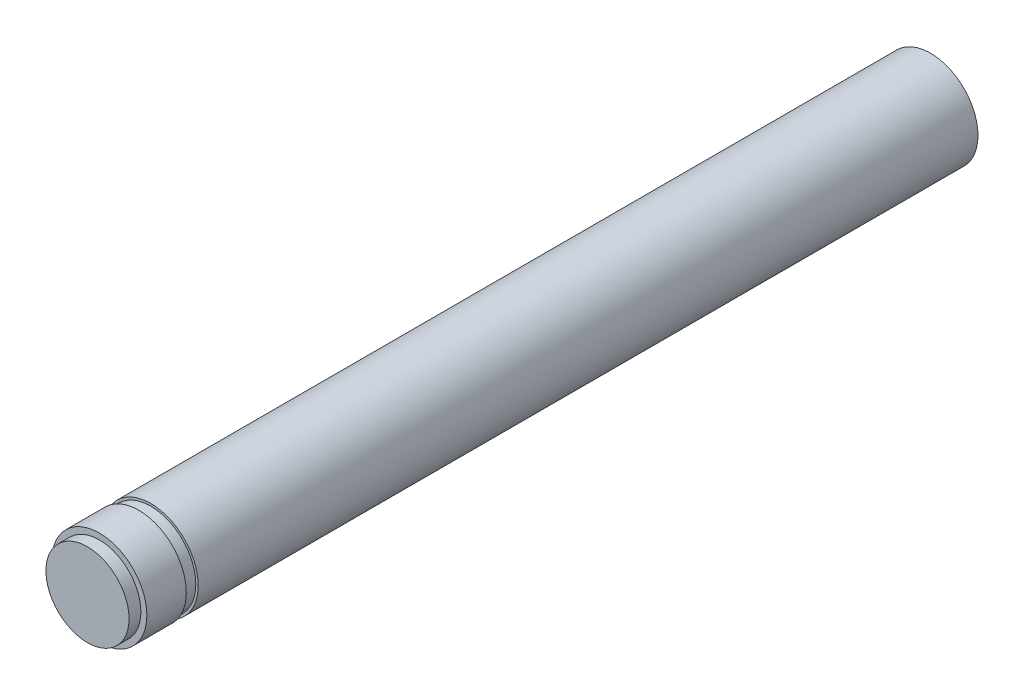
ISO-10303-21;
HEADER;
FILE_DESCRIPTION(('STEP AP214'),'2;1');
FILE_NAME('part.step','',(''),(''),'','','');
FILE_SCHEMA(('AUTOMOTIVE_DESIGN { 1 0 10303 214 1 1 1 1 }'));
ENDSEC;
DATA;
#1=APPLICATION_CONTEXT('core data for automotive mechanical design processes');
#2=APPLICATION_PROTOCOL_DEFINITION('international standard','automotive_design',2000,#1);
#3=PRODUCT_CONTEXT('',#1,'mechanical');
#4=PRODUCT('Part','Part','',(#3));
#5=PRODUCT_RELATED_PRODUCT_CATEGORY('part','',(#4));
#6=PRODUCT_DEFINITION_FORMATION('','',#4);
#7=PRODUCT_DEFINITION_CONTEXT('part definition',#1,'design');
#8=PRODUCT_DEFINITION('design','',#6,#7);
#9=PRODUCT_DEFINITION_SHAPE('','',#8);
#10=(LENGTH_UNIT() NAMED_UNIT(*) SI_UNIT(.MILLI.,.METRE.));
#11=(NAMED_UNIT(*) PLANE_ANGLE_UNIT() SI_UNIT($,.RADIAN.));
#12=(NAMED_UNIT(*) SI_UNIT($,.STERADIAN.) SOLID_ANGLE_UNIT());
#13=UNCERTAINTY_MEASURE_WITH_UNIT(LENGTH_MEASURE(1.E-05),#10,'distance_accuracy_value','');
#14=(GEOMETRIC_REPRESENTATION_CONTEXT(3) GLOBAL_UNCERTAINTY_ASSIGNED_CONTEXT((#13)) GLOBAL_UNIT_ASSIGNED_CONTEXT((#10,
#11,#12)) REPRESENTATION_CONTEXT('',''));
#15=CARTESIAN_POINT('',(0.,0.,0.));
#16=DIRECTION('',(0.,0.,1.));
#17=DIRECTION('',(1.,0.,0.));
#18=AXIS2_PLACEMENT_3D('',#15,#16,#17);
#19=CARTESIAN_POINT('',(0.,0.,0.));
#20=DIRECTION('',(0.,0.,-1.));
#21=DIRECTION('',(-1.,0.,0.));
#22=AXIS2_PLACEMENT_3D('',#19,#20,#21);
#23=PLANE('',#22);
#24=CARTESIAN_POINT('',(0.,0.,0.));
#25=DIRECTION('',(0.,0.,1.));
#26=DIRECTION('',(1.,0.,0.));
#27=AXIS2_PLACEMENT_3D('',#24,#25,#26);
#28=CIRCLE('',#27,4.);
#29=CARTESIAN_POINT('',(4.,0.,0.));
#30=VERTEX_POINT('',#29);
#31=EDGE_CURVE('E10',#30,#30,#28,.T.);
#32=ORIENTED_EDGE('',*,*,#31,.F.);
#33=EDGE_LOOP('',(#32));
#34=FACE_BOUND('',#33,.T.);
#35=ADVANCED_FACE('F43',(#34),#23,.T.);
#36=CARTESIAN_POINT('',(0.,0.,25.914367816092));
#37=DIRECTION('',(0.,0.,1.));
#38=DIRECTION('',(1.,0.,0.));
#39=AXIS2_PLACEMENT_3D('',#36,#37,#38);
#40=CYLINDRICAL_SURFACE('',#39,4.00000000000001);
#41=ORIENTED_EDGE('',*,*,#31,.T.);
#42=EDGE_LOOP('',(#41));
#43=FACE_BOUND('',#42,.T.);
#44=CARTESIAN_POINT('',(0.,0.,65.6761999999999));
#45=DIRECTION('',(0.,0.,1.));
#46=DIRECTION('',(1.,0.,0.));
#47=AXIS2_PLACEMENT_3D('',#44,#45,#46);
#48=CIRCLE('',#47,4.00000000000001);
#49=CARTESIAN_POINT('',(4.00000000000001,0.,65.6761999999999));
#50=VERTEX_POINT('',#49);
#51=EDGE_CURVE('E50',#50,#50,#48,.T.);
#52=ORIENTED_EDGE('',*,*,#51,.F.);
#53=EDGE_LOOP('',(#52));
#54=FACE_BOUND('',#53,.T.);
#55=ADVANCED_FACE('F98',(#43,#54),#40,.T.);
#56=CARTESIAN_POINT('',(3.8,0.,65.6761999999999));
#57=DIRECTION('',(0.,0.,1.));
#58=DIRECTION('',(1.,0.,0.));
#59=AXIS2_PLACEMENT_3D('',#56,#57,#58);
#60=PLANE('',#59);
#61=ORIENTED_EDGE('',*,*,#51,.T.);
#62=EDGE_LOOP('',(#61));
#63=FACE_BOUND('',#62,.T.);
#64=CARTESIAN_POINT('',(0.,0.,65.6761999999999));
#65=DIRECTION('',(0.,0.,1.));
#66=DIRECTION('',(1.,0.,0.));
#67=AXIS2_PLACEMENT_3D('',#64,#65,#66);
#68=CIRCLE('',#67,3.8);
#69=CARTESIAN_POINT('',(3.8,0.,65.6761999999999));
#70=VERTEX_POINT('',#69);
#71=EDGE_CURVE('E56',#70,#70,#68,.T.);
#72=ORIENTED_EDGE('',*,*,#71,.F.);
#73=EDGE_LOOP('',(#72));
#74=FACE_BOUND('',#73,.T.);
#75=ADVANCED_FACE('F102',(#63,#74),#60,.T.);
#76=CARTESIAN_POINT('',(0.,0.,25.914367816092));
#77=DIRECTION('',(0.,0.,1.));
#78=DIRECTION('',(1.,0.,0.));
#79=AXIS2_PLACEMENT_3D('',#76,#77,#78);
#80=CYLINDRICAL_SURFACE('',#79,3.8);
#81=ORIENTED_EDGE('',*,*,#71,.T.);
#82=EDGE_LOOP('',(#81));
#83=FACE_BOUND('',#82,.T.);
#84=CARTESIAN_POINT('',(0.,0.,66.6762));
#85=DIRECTION('',(0.,0.,1.));
#86=DIRECTION('',(1.,0.,0.));
#87=AXIS2_PLACEMENT_3D('',#84,#85,#86);
#88=CIRCLE('',#87,3.8);
#89=CARTESIAN_POINT('',(3.8,0.,66.6762));
#90=VERTEX_POINT('',#89);
#91=EDGE_CURVE('E62',#90,#90,#88,.T.);
#92=ORIENTED_EDGE('',*,*,#91,.F.);
#93=EDGE_LOOP('',(#92));
#94=FACE_BOUND('',#93,.T.);
#95=ADVANCED_FACE('F105',(#83,#94),#80,.T.);
#96=CARTESIAN_POINT('',(4.00000000000001,0.,66.6762));
#97=DIRECTION('',(0.,0.,-1.));
#98=DIRECTION('',(-1.,0.,0.));
#99=AXIS2_PLACEMENT_3D('',#96,#97,#98);
#100=PLANE('',#99);
#101=ORIENTED_EDGE('',*,*,#91,.T.);
#102=EDGE_LOOP('',(#101));
#103=FACE_BOUND('',#102,.T.);
#104=CARTESIAN_POINT('',(0.,0.,66.6762));
#105=DIRECTION('',(0.,0.,1.));
#106=DIRECTION('',(1.,0.,0.));
#107=AXIS2_PLACEMENT_3D('',#104,#105,#106);
#108=CIRCLE('',#107,4.00000000000001);
#109=CARTESIAN_POINT('',(4.00000000000001,0.,66.6762));
#110=VERTEX_POINT('',#109);
#111=EDGE_CURVE('E68',#110,#110,#108,.T.);
#112=ORIENTED_EDGE('',*,*,#111,.F.);
#113=EDGE_LOOP('',(#112));
#114=FACE_BOUND('',#113,.T.);
#115=ADVANCED_FACE('F111',(#103,#114),#100,.T.);
#116=CARTESIAN_POINT('',(0.,0.,25.914367816092));
#117=DIRECTION('',(0.,0.,1.));
#118=DIRECTION('',(1.,0.,0.));
#119=AXIS2_PLACEMENT_3D('',#116,#117,#118);
#120=CYLINDRICAL_SURFACE('',#119,4.00000000000001);
#121=ORIENTED_EDGE('',*,*,#111,.T.);
#122=EDGE_LOOP('',(#121));
#123=FACE_BOUND('',#122,.T.);
#124=CARTESIAN_POINT('',(0.,0.,70.));
#125=DIRECTION('',(0.,0.,1.));
#126=DIRECTION('',(1.,0.,0.));
#127=AXIS2_PLACEMENT_3D('',#124,#125,#126);
#128=CIRCLE('',#127,4.00000000000001);
#129=CARTESIAN_POINT('',(4.00000000000001,0.,70.));
#130=VERTEX_POINT('',#129);
#131=EDGE_CURVE('E72',#130,#130,#128,.T.);
#132=ORIENTED_EDGE('',*,*,#131,.F.);
#133=EDGE_LOOP('',(#132));
#134=FACE_BOUND('',#133,.T.);
#135=ADVANCED_FACE('F94',(#123,#134),#120,.T.);
#136=CARTESIAN_POINT('',(3.5,0.,70.));
#137=DIRECTION('',(0.,0.,1.));
#138=DIRECTION('',(1.,0.,0.));
#139=AXIS2_PLACEMENT_3D('',#136,#137,#138);
#140=PLANE('',#139);
#141=ORIENTED_EDGE('',*,*,#131,.T.);
#142=EDGE_LOOP('',(#141));
#143=FACE_BOUND('',#142,.T.);
#144=CARTESIAN_POINT('',(0.,0.,70.));
#145=DIRECTION('',(0.,0.,1.));
#146=DIRECTION('',(1.,0.,0.));
#147=AXIS2_PLACEMENT_3D('',#144,#145,#146);
#148=CIRCLE('',#147,3.5);
#149=CARTESIAN_POINT('',(3.5,0.,70.));
#150=VERTEX_POINT('',#149);
#151=EDGE_CURVE('E75',#150,#150,#148,.T.);
#152=ORIENTED_EDGE('',*,*,#151,.F.);
#153=EDGE_LOOP('',(#152));
#154=FACE_BOUND('',#153,.T.);
#155=ADVANCED_FACE('F87',(#143,#154),#140,.T.);
#156=CARTESIAN_POINT('',(0.,0.,25.914367816092));
#157=DIRECTION('',(0.,0.,1.));
#158=DIRECTION('',(1.,0.,0.));
#159=AXIS2_PLACEMENT_3D('',#156,#157,#158);
#160=CYLINDRICAL_SURFACE('',#159,3.5);
#161=ORIENTED_EDGE('',*,*,#151,.T.);
#162=EDGE_LOOP('',(#161));
#163=FACE_BOUND('',#162,.T.);
#164=CARTESIAN_POINT('',(0.,0.,71.));
#165=DIRECTION('',(0.,0.,1.));
#166=DIRECTION('',(1.,0.,0.));
#167=AXIS2_PLACEMENT_3D('',#164,#165,#166);
#168=CIRCLE('',#167,3.5);
#169=CARTESIAN_POINT('',(3.5,0.,71.));
#170=VERTEX_POINT('',#169);
#171=EDGE_CURVE('E79',#170,#170,#168,.T.);
#172=ORIENTED_EDGE('',*,*,#171,.F.);
#173=EDGE_LOOP('',(#172));
#174=FACE_BOUND('',#173,.T.);
#175=ADVANCED_FACE('F85',(#163,#174),#160,.T.);
#176=CARTESIAN_POINT('',(3.5,0.,71.));
#177=DIRECTION('',(0.,0.,1.));
#178=DIRECTION('',(1.,0.,0.));
#179=AXIS2_PLACEMENT_3D('',#176,#177,#178);
#180=PLANE('',#179);
#181=ORIENTED_EDGE('',*,*,#171,.T.);
#182=EDGE_LOOP('',(#181));
#183=FACE_BOUND('',#182,.T.);
#184=ADVANCED_FACE('F83',(#183),#180,.T.);
#185=CLOSED_SHELL('',(#35,#55,#75,#95,#115,#135,#155,#175,#184));
#186=MANIFOLD_SOLID_BREP('B2',#185);
#187=ADVANCED_BREP_SHAPE_REPRESENTATION('',(#18,#186),#14);
#188=SHAPE_DEFINITION_REPRESENTATION(#9,#187);
ENDSEC;
END-ISO-10303-21;
